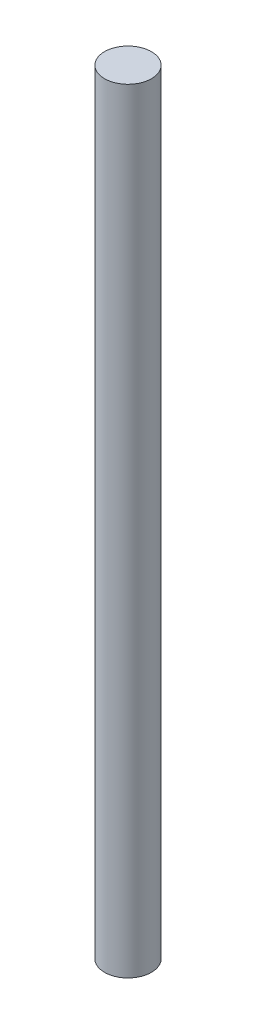
ISO-10303-21;
HEADER;
FILE_DESCRIPTION(('STEP AP214'),'2;1');
FILE_NAME('part.step','',(''),(''),'','','');
FILE_SCHEMA(('AUTOMOTIVE_DESIGN { 1 0 10303 214 1 1 1 1 }'));
ENDSEC;
DATA;
#1=APPLICATION_CONTEXT('core data for automotive mechanical design processes');
#2=APPLICATION_PROTOCOL_DEFINITION('international standard','automotive_design',2000,#1);
#3=PRODUCT_CONTEXT('',#1,'mechanical');
#4=PRODUCT('Part','Part','',(#3));
#5=PRODUCT_RELATED_PRODUCT_CATEGORY('part','',(#4));
#6=PRODUCT_DEFINITION_FORMATION('','',#4);
#7=PRODUCT_DEFINITION_CONTEXT('part definition',#1,'design');
#8=PRODUCT_DEFINITION('design','',#6,#7);
#9=PRODUCT_DEFINITION_SHAPE('','',#8);
#10=(LENGTH_UNIT() NAMED_UNIT(*) SI_UNIT(.MILLI.,.METRE.));
#11=(NAMED_UNIT(*) PLANE_ANGLE_UNIT() SI_UNIT($,.RADIAN.));
#12=(NAMED_UNIT(*) SI_UNIT($,.STERADIAN.) SOLID_ANGLE_UNIT());
#13=UNCERTAINTY_MEASURE_WITH_UNIT(LENGTH_MEASURE(1.E-05),#10,'distance_accuracy_value','');
#14=(GEOMETRIC_REPRESENTATION_CONTEXT(3) GLOBAL_UNCERTAINTY_ASSIGNED_CONTEXT((#13)) GLOBAL_UNIT_ASSIGNED_CONTEXT((#10,
#11,#12)) REPRESENTATION_CONTEXT('',''));
#15=CARTESIAN_POINT('',(0.,0.,0.));
#16=DIRECTION('',(0.,0.,1.));
#17=DIRECTION('',(1.,0.,0.));
#18=AXIS2_PLACEMENT_3D('',#15,#16,#17);
#19=CARTESIAN_POINT('',(0.,-165.,0.));
#20=DIRECTION('',(0.,1.,0.));
#21=DIRECTION('',(0.,0.,1.));
#22=AXIS2_PLACEMENT_3D('',#19,#20,#21);
#23=CYLINDRICAL_SURFACE('',#22,5.);
#24=CARTESIAN_POINT('',(0.,-165.,0.));
#25=DIRECTION('',(0.,1.,0.));
#26=DIRECTION('',(0.,0.,1.));
#27=AXIS2_PLACEMENT_3D('',#24,#25,#26);
#28=CIRCLE('',#27,5.);
#29=CARTESIAN_POINT('',(0.,-165.,5.));
#30=VERTEX_POINT('',#29);
#31=EDGE_CURVE('E10',#30,#30,#28,.T.);
#32=ORIENTED_EDGE('',*,*,#31,.T.);
#33=EDGE_LOOP('',(#32));
#34=FACE_BOUND('',#33,.T.);
#35=CARTESIAN_POINT('',(0.,0.,0.));
#36=DIRECTION('',(0.,1.,0.));
#37=DIRECTION('',(0.,0.,1.));
#38=AXIS2_PLACEMENT_3D('',#35,#36,#37);
#39=CIRCLE('',#38,5.);
#40=CARTESIAN_POINT('',(0.,0.,5.));
#41=VERTEX_POINT('',#40);
#42=EDGE_CURVE('E34',#41,#41,#39,.T.);
#43=ORIENTED_EDGE('',*,*,#42,.F.);
#44=EDGE_LOOP('',(#43));
#45=FACE_BOUND('',#44,.T.);
#46=ADVANCED_FACE('F31',(#34,#45),#23,.T.);
#47=CARTESIAN_POINT('',(0.,-165.,0.));
#48=DIRECTION('',(0.,1.,0.));
#49=DIRECTION('',(0.,0.,1.));
#50=AXIS2_PLACEMENT_3D('',#47,#48,#49);
#51=PLANE('',#50);
#52=ORIENTED_EDGE('',*,*,#31,.F.);
#53=EDGE_LOOP('',(#52));
#54=FACE_BOUND('',#53,.T.);
#55=ADVANCED_FACE('F46',(#54),#51,.F.);
#56=CARTESIAN_POINT('',(0.,0.,0.));
#57=DIRECTION('',(0.,1.,0.));
#58=DIRECTION('',(0.,0.,1.));
#59=AXIS2_PLACEMENT_3D('',#56,#57,#58);
#60=PLANE('',#59);
#61=ORIENTED_EDGE('',*,*,#42,.T.);
#62=EDGE_LOOP('',(#61));
#63=FACE_BOUND('',#62,.T.);
#64=ADVANCED_FACE('F43',(#63),#60,.T.);
#65=CLOSED_SHELL('',(#46,#55,#64));
#66=MANIFOLD_SOLID_BREP('B2',#65);
#67=ADVANCED_BREP_SHAPE_REPRESENTATION('',(#18,#66),#14);
#68=SHAPE_DEFINITION_REPRESENTATION(#9,#67);
ENDSEC;
END-ISO-10303-21;
